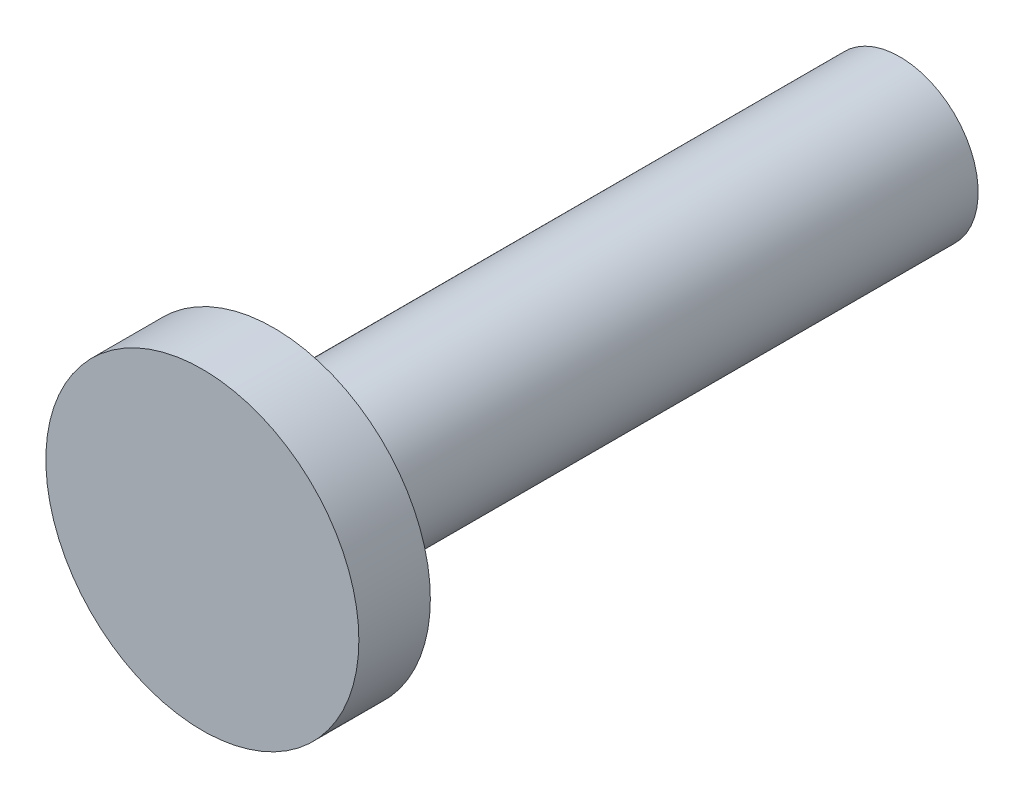
ISO-10303-21;
HEADER;
FILE_DESCRIPTION(('STEP AP214'),'2;1');
FILE_NAME('part.step','',(''),(''),'','','');
FILE_SCHEMA(('AUTOMOTIVE_DESIGN { 1 0 10303 214 1 1 1 1 }'));
ENDSEC;
DATA;
#1=APPLICATION_CONTEXT('core data for automotive mechanical design processes');
#2=APPLICATION_PROTOCOL_DEFINITION('international standard','automotive_design',2000,#1);
#3=PRODUCT_CONTEXT('',#1,'mechanical');
#4=PRODUCT('Part','Part','',(#3));
#5=PRODUCT_RELATED_PRODUCT_CATEGORY('part','',(#4));
#6=PRODUCT_DEFINITION_FORMATION('','',#4);
#7=PRODUCT_DEFINITION_CONTEXT('part definition',#1,'design');
#8=PRODUCT_DEFINITION('design','',#6,#7);
#9=PRODUCT_DEFINITION_SHAPE('','',#8);
#10=(LENGTH_UNIT() NAMED_UNIT(*) SI_UNIT(.MILLI.,.METRE.));
#11=(NAMED_UNIT(*) PLANE_ANGLE_UNIT() SI_UNIT($,.RADIAN.));
#12=(NAMED_UNIT(*) SI_UNIT($,.STERADIAN.) SOLID_ANGLE_UNIT());
#13=UNCERTAINTY_MEASURE_WITH_UNIT(LENGTH_MEASURE(1.E-05),#10,'distance_accuracy_value','');
#14=(GEOMETRIC_REPRESENTATION_CONTEXT(3) GLOBAL_UNCERTAINTY_ASSIGNED_CONTEXT((#13)) GLOBAL_UNIT_ASSIGNED_CONTEXT((#10,
#11,#12)) REPRESENTATION_CONTEXT('',''));
#15=CARTESIAN_POINT('',(0.,0.,0.));
#16=DIRECTION('',(0.,0.,1.));
#17=DIRECTION('',(1.,0.,0.));
#18=AXIS2_PLACEMENT_3D('',#15,#16,#17);
#19=CARTESIAN_POINT('',(0.,0.,1.37));
#20=DIRECTION('',(0.,0.,-1.));
#21=DIRECTION('',(-1.,0.,0.));
#22=AXIS2_PLACEMENT_3D('',#19,#20,#21);
#23=CYLINDRICAL_SURFACE('',#22,3.);
#24=CARTESIAN_POINT('',(0.,0.,1.37));
#25=DIRECTION('',(0.,0.,1.));
#26=DIRECTION('',(1.,0.,0.));
#27=AXIS2_PLACEMENT_3D('',#24,#25,#26);
#28=CIRCLE('',#27,3.);
#29=CARTESIAN_POINT('',(3.,0.,1.37));
#30=VERTEX_POINT('',#29);
#31=EDGE_CURVE('E38',#30,#30,#28,.T.);
#32=ORIENTED_EDGE('',*,*,#31,.F.);
#33=EDGE_LOOP('',(#32));
#34=FACE_BOUND('',#33,.T.);
#35=CARTESIAN_POINT('',(0.,0.,0.));
#36=DIRECTION('',(0.,0.,1.));
#37=DIRECTION('',(1.,0.,0.));
#38=AXIS2_PLACEMENT_3D('',#35,#36,#37);
#39=CIRCLE('',#38,3.);
#40=CARTESIAN_POINT('',(3.,0.,0.));
#41=VERTEX_POINT('',#40);
#42=EDGE_CURVE('E34',#41,#41,#39,.T.);
#43=ORIENTED_EDGE('',*,*,#42,.T.);
#44=EDGE_LOOP('',(#43));
#45=FACE_BOUND('',#44,.T.);
#46=ADVANCED_FACE('F31',(#34,#45),#23,.T.);
#47=CARTESIAN_POINT('',(0.,0.,1.37));
#48=DIRECTION('',(0.,0.,1.));
#49=DIRECTION('',(1.,0.,0.));
#50=AXIS2_PLACEMENT_3D('',#47,#48,#49);
#51=PLANE('',#50);
#52=ORIENTED_EDGE('',*,*,#31,.T.);
#53=EDGE_LOOP('',(#52));
#54=FACE_BOUND('',#53,.T.);
#55=ADVANCED_FACE('F55',(#54),#51,.T.);
#56=CARTESIAN_POINT('',(0.,0.,0.));
#57=DIRECTION('',(0.,0.,1.));
#58=DIRECTION('',(1.,0.,0.));
#59=AXIS2_PLACEMENT_3D('',#56,#57,#58);
#60=PLANE('',#59);
#61=CARTESIAN_POINT('',(0.,0.,0.));
#62=DIRECTION('',(0.,0.,-1.));
#63=DIRECTION('',(-1.,0.,0.));
#64=AXIS2_PLACEMENT_3D('',#61,#62,#63);
#65=CIRCLE('',#64,1.5);
#66=CARTESIAN_POINT('',(-1.5,0.,0.));
#67=VERTEX_POINT('',#66);
#68=EDGE_CURVE('E10',#67,#67,#65,.T.);
#69=ORIENTED_EDGE('',*,*,#68,.F.);
#70=EDGE_LOOP('',(#69));
#71=FACE_BOUND('',#70,.T.);
#72=ORIENTED_EDGE('',*,*,#42,.F.);
#73=EDGE_LOOP('',(#72));
#74=FACE_BOUND('',#73,.T.);
#75=ADVANCED_FACE('F52',(#71,#74),#60,.F.);
#76=CARTESIAN_POINT('',(0.,0.,-12.));
#77=DIRECTION('',(0.,0.,1.));
#78=DIRECTION('',(1.,0.,0.));
#79=AXIS2_PLACEMENT_3D('',#76,#77,#78);
#80=CYLINDRICAL_SURFACE('',#79,1.5);
#81=CARTESIAN_POINT('',(0.,0.,-12.));
#82=DIRECTION('',(0.,0.,-1.));
#83=DIRECTION('',(-1.,0.,0.));
#84=AXIS2_PLACEMENT_3D('',#81,#82,#83);
#85=CIRCLE('',#84,1.5);
#86=CARTESIAN_POINT('',(-1.5,0.,-12.));
#87=VERTEX_POINT('',#86);
#88=EDGE_CURVE('E44',#87,#87,#85,.T.);
#89=ORIENTED_EDGE('',*,*,#88,.F.);
#90=EDGE_LOOP('',(#89));
#91=FACE_BOUND('',#90,.T.);
#92=ORIENTED_EDGE('',*,*,#68,.T.);
#93=EDGE_LOOP('',(#92));
#94=FACE_BOUND('',#93,.T.);
#95=ADVANCED_FACE('F54',(#91,#94),#80,.T.);
#96=CARTESIAN_POINT('',(0.,0.,-12.));
#97=DIRECTION('',(0.,0.,-1.));
#98=DIRECTION('',(-1.,0.,0.));
#99=AXIS2_PLACEMENT_3D('',#96,#97,#98);
#100=PLANE('',#99);
#101=ORIENTED_EDGE('',*,*,#88,.T.);
#102=EDGE_LOOP('',(#101));
#103=FACE_BOUND('',#102,.T.);
#104=ADVANCED_FACE('F61',(#103),#100,.T.);
#105=CLOSED_SHELL('',(#46,#55,#75,#95,#104));
#106=MANIFOLD_SOLID_BREP('B2',#105);
#107=ADVANCED_BREP_SHAPE_REPRESENTATION('',(#18,#106),#14);
#108=SHAPE_DEFINITION_REPRESENTATION(#9,#107);
ENDSEC;
END-ISO-10303-21;
